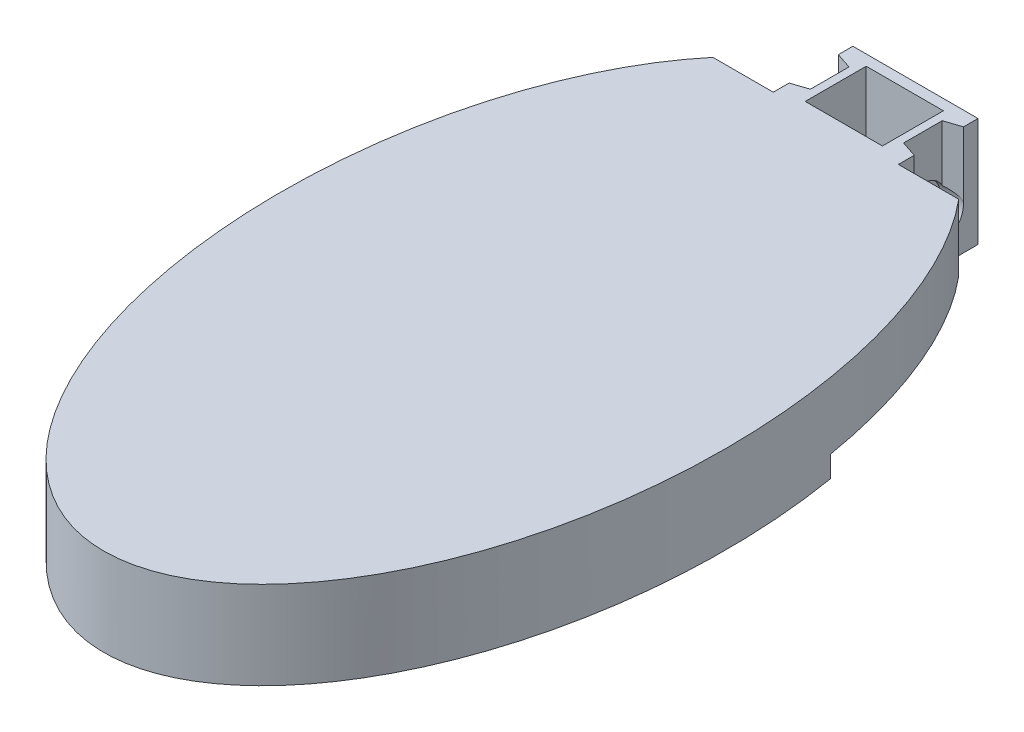
ISO-10303-21;
HEADER;
FILE_DESCRIPTION(('STEP AP214'),'2;1');
FILE_NAME('part.step','',(''),(''),'','','');
FILE_SCHEMA(('AUTOMOTIVE_DESIGN { 1 0 10303 214 1 1 1 1 }'));
ENDSEC;
DATA;
#1=APPLICATION_CONTEXT('core data for automotive mechanical design processes');
#2=APPLICATION_PROTOCOL_DEFINITION('international standard','automotive_design',2000,#1);
#3=PRODUCT_CONTEXT('',#1,'mechanical');
#4=PRODUCT('Part','Part','',(#3));
#5=PRODUCT_RELATED_PRODUCT_CATEGORY('part','',(#4));
#6=PRODUCT_DEFINITION_FORMATION('','',#4);
#7=PRODUCT_DEFINITION_CONTEXT('part definition',#1,'design');
#8=PRODUCT_DEFINITION('design','',#6,#7);
#9=PRODUCT_DEFINITION_SHAPE('','',#8);
#10=(LENGTH_UNIT() NAMED_UNIT(*) SI_UNIT(.MILLI.,.METRE.));
#11=(NAMED_UNIT(*) PLANE_ANGLE_UNIT() SI_UNIT($,.RADIAN.));
#12=(NAMED_UNIT(*) SI_UNIT($,.STERADIAN.) SOLID_ANGLE_UNIT());
#13=UNCERTAINTY_MEASURE_WITH_UNIT(LENGTH_MEASURE(1.E-05),#10,'distance_accuracy_value','');
#14=(GEOMETRIC_REPRESENTATION_CONTEXT(3) GLOBAL_UNCERTAINTY_ASSIGNED_CONTEXT((#13)) GLOBAL_UNIT_ASSIGNED_CONTEXT((#10,
#11,#12)) REPRESENTATION_CONTEXT('',''));
#15=CARTESIAN_POINT('',(0.,0.,0.));
#16=DIRECTION('',(0.,0.,1.));
#17=DIRECTION('',(1.,0.,0.));
#18=AXIS2_PLACEMENT_3D('',#15,#16,#17);
#19=CARTESIAN_POINT('',(-20.318866475745,-2.032,-10.922));
#20=DIRECTION('',(0.,0.,1.));
#21=DIRECTION('',(1.,0.,0.));
#22=AXIS2_PLACEMENT_3D('',#19,#20,#21);
#23=PLANE('',#22);
#24=DIRECTION('',(1.,0.,0.));
#25=VECTOR('',#24,1.);
#26=CARTESIAN_POINT('',(-20.318866475745,0.,-10.922));
#27=LINE('',#26,#25);
#28=CARTESIAN_POINT('',(-20.318866475745,0.,-10.922));
#29=VERTEX_POINT('',#28);
#30=CARTESIAN_POINT('',(-16.000866475745,0.,-10.922));
#31=VERTEX_POINT('',#30);
#32=EDGE_CURVE('E57',#29,#31,#27,.T.);
#33=ORIENTED_EDGE('',*,*,#32,.T.);
#34=DIRECTION('',(0.,-1.,0.));
#35=VECTOR('',#34,1.);
#36=CARTESIAN_POINT('',(-16.000866475745,36.0095961085165,-10.922));
#37=LINE('',#36,#35);
#38=CARTESIAN_POINT('',(-16.000866475745,-2.032,-10.922));
#39=VERTEX_POINT('',#38);
#40=EDGE_CURVE('E253',#31,#39,#37,.T.);
#41=ORIENTED_EDGE('',*,*,#40,.T.);
#42=DIRECTION('',(1.,0.,0.));
#43=VECTOR('',#42,1.);
#44=CARTESIAN_POINT('',(-20.318866475745,-2.032,-10.922));
#45=LINE('',#44,#43);
#46=CARTESIAN_POINT('',(-20.318866475745,-2.032,-10.922));
#47=VERTEX_POINT('',#46);
#48=EDGE_CURVE('E285',#47,#39,#45,.T.);
#49=ORIENTED_EDGE('',*,*,#48,.F.);
#50=DIRECTION('',(0.,1.,0.));
#51=VECTOR('',#50,1.);
#52=CARTESIAN_POINT('',(-20.318866475745,-2.032,-10.922));
#53=LINE('',#52,#51);
#54=EDGE_CURVE('E292',#47,#29,#53,.T.);
#55=ORIENTED_EDGE('',*,*,#54,.T.);
#56=EDGE_LOOP('',(#33,#41,#49,#55));
#57=FACE_BOUND('',#56,.T.);
#58=ADVANCED_FACE('F33',(#57),#23,.F.);
#59=CARTESIAN_POINT('',(0.,0.,0.));
#60=DIRECTION('',(0.,1.,0.));
#61=DIRECTION('',(0.,0.,1.));
#62=AXIS2_PLACEMENT_3D('',#59,#60,#61);
#63=PLANE('',#62);
#64=DIRECTION('',(1.,0.,0.));
#65=VECTOR('',#64,1.);
#66=CARTESIAN_POINT('',(-10.4004959003833,0.,-27.432));
#67=LINE('',#66,#65);
#68=CARTESIAN_POINT('',(-10.4004959003833,0.,-27.432));
#69=VERTEX_POINT('',#68);
#70=CARTESIAN_POINT('',(-6.858,0.,-27.432));
#71=VERTEX_POINT('',#70);
#72=EDGE_CURVE('E243',#69,#71,#67,.T.);
#73=ORIENTED_EDGE('',*,*,#72,.F.);
#74=DIRECTION('',(0.321232737556786,0.,-0.947000278944929));
#75=VECTOR('',#74,1.);
#76=CARTESIAN_POINT('',(-16.000866475745,0.,-10.922));
#77=LINE('',#76,#75);
#78=EDGE_CURVE('E249',#31,#69,#77,.T.);
#79=ORIENTED_EDGE('',*,*,#78,.F.);
#80=ORIENTED_EDGE('',*,*,#32,.F.);
#81=CARTESIAN_POINT('',(0.,0.,0.));
#82=DIRECTION('',(0.,1.,0.));
#83=DIRECTION('',(0.,0.,-1.));
#84=AXIS2_PLACEMENT_3D('',#81,#82,#83);
#85=ELLIPSE('',#84,38.1,21.209);
#86=CARTESIAN_POINT('',(-11.7237158631079,0.,-31.75));
#87=VERTEX_POINT('',#86);
#88=EDGE_CURVE('E446',#87,#29,#85,.T.);
#89=ORIENTED_EDGE('',*,*,#88,.F.);
#90=DIRECTION('',(1.,0.,0.));
#91=VECTOR('',#90,1.);
#92=CARTESIAN_POINT('',(-5.969,0.,-31.75));
#93=LINE('',#92,#91);
#94=CARTESIAN_POINT('',(-5.969,0.,-31.75));
#95=VERTEX_POINT('',#94);
#96=EDGE_CURVE('E295',#87,#95,#93,.T.);
#97=ORIENTED_EDGE('',*,*,#96,.T.);
#98=DIRECTION('',(1.,0.,0.));
#99=VECTOR('',#98,1.);
#100=CARTESIAN_POINT('',(-11.7237158631079,0.,-31.75));
#101=LINE('',#100,#99);
#102=CARTESIAN_POINT('',(5.969,0.,-31.75));
#103=VERTEX_POINT('',#102);
#104=EDGE_CURVE('E430',#95,#103,#101,.T.);
#105=ORIENTED_EDGE('',*,*,#104,.T.);
#106=DIRECTION('',(1.,0.,0.));
#107=VECTOR('',#106,1.);
#108=CARTESIAN_POINT('',(11.723715863108,0.,-31.75));
#109=LINE('',#108,#107);
#110=CARTESIAN_POINT('',(11.723715863108,0.,-31.75));
#111=VERTEX_POINT('',#110);
#112=EDGE_CURVE('E298',#103,#111,#109,.T.);
#113=ORIENTED_EDGE('',*,*,#112,.T.);
#114=CARTESIAN_POINT('',(20.318866475745,0.,-10.922));
#115=VERTEX_POINT('',#114);
#116=EDGE_CURVE('E440',#115,#111,#85,.T.);
#117=ORIENTED_EDGE('',*,*,#116,.F.);
#118=CARTESIAN_POINT('',(16.000866475745,0.,-10.922));
#119=VERTEX_POINT('',#118);
#120=EDGE_CURVE('E280',#119,#115,#27,.T.);
#121=ORIENTED_EDGE('',*,*,#120,.F.);
#122=DIRECTION('',(0.321232737556786,0.,0.947000278944929));
#123=VECTOR('',#122,1.);
#124=CARTESIAN_POINT('',(16.000866475745,0.,-10.922));
#125=LINE('',#124,#123);
#126=CARTESIAN_POINT('',(10.4004959003833,0.,-27.432));
#127=VERTEX_POINT('',#126);
#128=EDGE_CURVE('E267',#127,#119,#125,.T.);
#129=ORIENTED_EDGE('',*,*,#128,.F.);
#130=DIRECTION('',(1.,0.,0.));
#131=VECTOR('',#130,1.);
#132=CARTESIAN_POINT('',(10.4004959003833,0.,-27.432));
#133=LINE('',#132,#131);
#134=CARTESIAN_POINT('',(6.858,0.,-27.432));
#135=VERTEX_POINT('',#134);
#136=EDGE_CURVE('E270',#135,#127,#133,.T.);
#137=ORIENTED_EDGE('',*,*,#136,.F.);
#138=DIRECTION('',(0.,0.,-1.));
#139=VECTOR('',#138,1.);
#140=CARTESIAN_POINT('',(6.858,0.,-27.432));
#141=LINE('',#140,#139);
#142=CARTESIAN_POINT('',(6.858,0.,-21.082));
#143=VERTEX_POINT('',#142);
#144=EDGE_CURVE('E273',#143,#135,#141,.T.);
#145=ORIENTED_EDGE('',*,*,#144,.F.);
#146=CARTESIAN_POINT('',(0.,0.,-21.082));
#147=DIRECTION('',(0.,1.,0.));
#148=DIRECTION('',(0.,0.,1.));
#149=AXIS2_PLACEMENT_3D('',#146,#147,#148);
#150=CIRCLE('',#149,6.858);
#151=CARTESIAN_POINT('',(-6.858,0.,-21.082));
#152=VERTEX_POINT('',#151);
#153=EDGE_CURVE('E276',#152,#143,#150,.T.);
#154=ORIENTED_EDGE('',*,*,#153,.F.);
#155=DIRECTION('',(0.,0.,1.));
#156=VECTOR('',#155,1.);
#157=CARTESIAN_POINT('',(-6.858,0.,-27.432));
#158=LINE('',#157,#156);
#159=EDGE_CURVE('E258',#71,#152,#158,.T.);
#160=ORIENTED_EDGE('',*,*,#159,.F.);
#161=EDGE_LOOP('',(#73,#79,#80,#89,#97,#105,#113,#117,#121,#129,#137,#145,#154,#160));
#162=FACE_BOUND('',#161,.T.);
#163=ADVANCED_FACE('F255',(#162),#63,.F.);
#164=CARTESIAN_POINT('',(-5.969,3.81,-24.1554));
#165=DIRECTION('',(-1.,0.,0.));
#166=DIRECTION('',(0.,0.,1.));
#167=AXIS2_PLACEMENT_3D('',#164,#165,#166);
#168=PLANE('',#167);
#169=DIRECTION('',(0.,-1.,0.));
#170=VECTOR('',#169,1.);
#171=CARTESIAN_POINT('',(-5.969,6.35,-31.75));
#172=LINE('',#171,#170);
#173=CARTESIAN_POINT('',(-5.969,-2.032,-31.75));
#174=VERTEX_POINT('',#173);
#175=EDGE_CURVE('E384',#95,#174,#172,.T.);
#176=ORIENTED_EDGE('',*,*,#175,.F.);
#177=CARTESIAN_POINT('',(-5.969,6.35,-31.75));
#178=VERTEX_POINT('',#177);
#179=EDGE_CURVE('E386',#178,#95,#172,.T.);
#180=ORIENTED_EDGE('',*,*,#179,.F.);
#181=DIRECTION('',(0.,0.,1.));
#182=VECTOR('',#181,1.);
#183=CARTESIAN_POINT('',(-5.969,6.35,-39.3446));
#184=LINE('',#183,#182);
#185=CARTESIAN_POINT('',(-5.969,6.35,-33.2612999999999));
#186=VERTEX_POINT('',#185);
#187=EDGE_CURVE('E385',#186,#178,#184,.T.);
#188=ORIENTED_EDGE('',*,*,#187,.F.);
#189=DIRECTION('',(0.,1.,0.));
#190=VECTOR('',#189,1.);
#191=CARTESIAN_POINT('',(-5.969,0.,-33.2612999999999));
#192=LINE('',#191,#190);
#193=CARTESIAN_POINT('',(-5.969,0.,-33.2612999999999));
#194=VERTEX_POINT('',#193);
#195=EDGE_CURVE('E341',#194,#186,#192,.T.);
#196=ORIENTED_EDGE('',*,*,#195,.F.);
#197=CARTESIAN_POINT('',(-5.969,0.,-35.6108));
#198=DIRECTION('',(-1.,0.,0.));
#199=DIRECTION('',(0.,0.,1.));
#200=AXIS2_PLACEMENT_3D('',#197,#198,#199);
#201=CIRCLE('',#200,2.3495);
#202=CARTESIAN_POINT('',(-5.969,0.,-37.9603));
#203=VERTEX_POINT('',#202);
#204=EDGE_CURVE('E345',#203,#194,#201,.T.);
#205=ORIENTED_EDGE('',*,*,#204,.F.);
#206=DIRECTION('',(0.,1.,0.));
#207=VECTOR('',#206,1.);
#208=CARTESIAN_POINT('',(-5.969,0.,-37.9603));
#209=LINE('',#208,#207);
#210=CARTESIAN_POINT('',(-5.969,6.35,-37.9603));
#211=VERTEX_POINT('',#210);
#212=EDGE_CURVE('E342',#203,#211,#209,.T.);
#213=ORIENTED_EDGE('',*,*,#212,.T.);
#214=CARTESIAN_POINT('',(-5.969,6.35,-39.3446));
#215=VERTEX_POINT('',#214);
#216=EDGE_CURVE('E381',#215,#211,#184,.T.);
#217=ORIENTED_EDGE('',*,*,#216,.F.);
#218=DIRECTION('',(0.,1.,0.));
#219=VECTOR('',#218,1.);
#220=CARTESIAN_POINT('',(-5.969,-4.064,-39.3446));
#221=LINE('',#220,#219);
#222=CARTESIAN_POINT('',(-5.969,-4.064,-39.3446));
#223=VERTEX_POINT('',#222);
#224=EDGE_CURVE('E397',#223,#215,#221,.T.);
#225=ORIENTED_EDGE('',*,*,#224,.F.);
#226=DIRECTION('',(0.,0.,-1.));
#227=VECTOR('',#226,1.);
#228=CARTESIAN_POINT('',(-5.969,-4.064,-34.8996));
#229=LINE('',#228,#227);
#230=CARTESIAN_POINT('',(-5.969,-4.064,-34.8996));
#231=VERTEX_POINT('',#230);
#232=EDGE_CURVE('E394',#231,#223,#229,.T.);
#233=ORIENTED_EDGE('',*,*,#232,.F.);
#234=DIRECTION('',(0.,-0.554700196225229,-0.832050294337844));
#235=VECTOR('',#234,1.);
#236=CARTESIAN_POINT('',(-5.969,-2.032,-31.8516));
#237=LINE('',#236,#235);
#238=CARTESIAN_POINT('',(-5.969,-2.032,-31.8516));
#239=VERTEX_POINT('',#238);
#240=EDGE_CURVE('E391',#239,#231,#237,.T.);
#241=ORIENTED_EDGE('',*,*,#240,.F.);
#242=DIRECTION('',(0.,0.,-1.));
#243=VECTOR('',#242,1.);
#244=CARTESIAN_POINT('',(-5.969,-2.032,-31.75));
#245=LINE('',#244,#243);
#246=EDGE_CURVE('E388',#174,#239,#245,.T.);
#247=ORIENTED_EDGE('',*,*,#246,.F.);
#248=EDGE_LOOP('',(#176,#180,#188,#196,#205,#213,#217,#225,#233,#241,#247));
#249=FACE_BOUND('',#248,.T.);
#250=ADVANCED_FACE('F475',(#249),#168,.T.);
#251=CARTESIAN_POINT('',(5.969,3.81,-31.75));
#252=DIRECTION('',(1.,0.,0.));
#253=DIRECTION('',(0.,0.,-1.));
#254=AXIS2_PLACEMENT_3D('',#251,#252,#253);
#255=PLANE('',#254);
#256=DIRECTION('',(0.,-1.,0.));
#257=VECTOR('',#256,1.);
#258=CARTESIAN_POINT('',(5.969,6.35,-31.75));
#259=LINE('',#258,#257);
#260=CARTESIAN_POINT('',(5.969,6.35,-31.75));
#261=VERTEX_POINT('',#260);
#262=EDGE_CURVE('E405',#261,#103,#259,.T.);
#263=ORIENTED_EDGE('',*,*,#262,.T.);
#264=CARTESIAN_POINT('',(5.969,-2.032,-31.75));
#265=VERTEX_POINT('',#264);
#266=EDGE_CURVE('E404',#103,#265,#259,.T.);
#267=ORIENTED_EDGE('',*,*,#266,.T.);
#268=DIRECTION('',(0.,0.,-1.));
#269=VECTOR('',#268,1.);
#270=CARTESIAN_POINT('',(5.969,-2.032,-31.75));
#271=LINE('',#270,#269);
#272=CARTESIAN_POINT('',(5.969,-2.032,-31.8516));
#273=VERTEX_POINT('',#272);
#274=EDGE_CURVE('E407',#265,#273,#271,.T.);
#275=ORIENTED_EDGE('',*,*,#274,.T.);
#276=DIRECTION('',(0.,-0.554700196225229,-0.832050294337844));
#277=VECTOR('',#276,1.);
#278=CARTESIAN_POINT('',(5.969,-2.032,-31.8516));
#279=LINE('',#278,#277);
#280=CARTESIAN_POINT('',(5.969,-4.064,-34.8996));
#281=VERTEX_POINT('',#280);
#282=EDGE_CURVE('E410',#273,#281,#279,.T.);
#283=ORIENTED_EDGE('',*,*,#282,.T.);
#284=DIRECTION('',(0.,0.,-1.));
#285=VECTOR('',#284,1.);
#286=CARTESIAN_POINT('',(5.969,-4.064,-34.8996));
#287=LINE('',#286,#285);
#288=CARTESIAN_POINT('',(5.969,-4.064,-39.3446));
#289=VERTEX_POINT('',#288);
#290=EDGE_CURVE('E413',#281,#289,#287,.T.);
#291=ORIENTED_EDGE('',*,*,#290,.T.);
#292=DIRECTION('',(0.,1.,0.));
#293=VECTOR('',#292,1.);
#294=CARTESIAN_POINT('',(5.969,-4.064,-39.3446));
#295=LINE('',#294,#293);
#296=CARTESIAN_POINT('',(5.969,6.35,-39.3446));
#297=VERTEX_POINT('',#296);
#298=EDGE_CURVE('E416',#289,#297,#295,.T.);
#299=ORIENTED_EDGE('',*,*,#298,.T.);
#300=DIRECTION('',(0.,0.,1.));
#301=VECTOR('',#300,1.);
#302=CARTESIAN_POINT('',(5.969,6.35,-39.3446));
#303=LINE('',#302,#301);
#304=CARTESIAN_POINT('',(5.969,6.35,-37.9603));
#305=VERTEX_POINT('',#304);
#306=EDGE_CURVE('E401',#297,#305,#303,.T.);
#307=ORIENTED_EDGE('',*,*,#306,.T.);
#308=DIRECTION('',(0.,1.,0.));
#309=VECTOR('',#308,1.);
#310=CARTESIAN_POINT('',(5.969,0.,-37.9603));
#311=LINE('',#310,#309);
#312=CARTESIAN_POINT('',(5.969,0.,-37.9603));
#313=VERTEX_POINT('',#312);
#314=EDGE_CURVE('E365',#313,#305,#311,.T.);
#315=ORIENTED_EDGE('',*,*,#314,.F.);
#316=CARTESIAN_POINT('',(5.969,0.,-35.6108));
#317=DIRECTION('',(-1.,0.,0.));
#318=DIRECTION('',(0.,0.,1.));
#319=AXIS2_PLACEMENT_3D('',#316,#317,#318);
#320=CIRCLE('',#319,2.3495);
#321=CARTESIAN_POINT('',(5.969,0.,-33.2612999999999));
#322=VERTEX_POINT('',#321);
#323=EDGE_CURVE('E369',#313,#322,#320,.T.);
#324=ORIENTED_EDGE('',*,*,#323,.T.);
#325=DIRECTION('',(0.,1.,0.));
#326=VECTOR('',#325,1.);
#327=CARTESIAN_POINT('',(5.969,0.,-33.2612999999999));
#328=LINE('',#327,#326);
#329=CARTESIAN_POINT('',(5.969,6.35,-33.2612999999999));
#330=VERTEX_POINT('',#329);
#331=EDGE_CURVE('E366',#322,#330,#328,.T.);
#332=ORIENTED_EDGE('',*,*,#331,.T.);
#333=EDGE_CURVE('E380',#330,#261,#303,.T.);
#334=ORIENTED_EDGE('',*,*,#333,.T.);
#335=EDGE_LOOP('',(#263,#267,#275,#283,#291,#299,#307,#315,#324,#332,#334));
#336=FACE_BOUND('',#335,.T.);
#337=ADVANCED_FACE('F497',(#336),#255,.T.);
#338=CARTESIAN_POINT('',(0.,6.35,0.));
#339=DIRECTION('',(0.,1.,0.));
#340=DIRECTION('',(0.,0.,1.));
#341=AXIS2_PLACEMENT_3D('',#338,#339,#340);
#342=PLANE('',#341);
#343=DIRECTION('',(1.,0.,0.));
#344=VECTOR('',#343,1.);
#345=CARTESIAN_POINT('',(-3.683,6.35,-32.512));
#346=LINE('',#345,#344);
#347=CARTESIAN_POINT('',(-3.683,6.35,-32.512));
#348=VERTEX_POINT('',#347);
#349=CARTESIAN_POINT('',(3.683,6.35,-32.512));
#350=VERTEX_POINT('',#349);
#351=EDGE_CURVE('E308',#348,#350,#346,.T.);
#352=ORIENTED_EDGE('',*,*,#351,.F.);
#353=DIRECTION('',(0.,0.,1.));
#354=VECTOR('',#353,1.);
#355=CARTESIAN_POINT('',(-3.683,6.35,-38.3286));
#356=LINE('',#355,#354);
#357=CARTESIAN_POINT('',(-3.683,6.35,-38.3286));
#358=VERTEX_POINT('',#357);
#359=EDGE_CURVE('E301',#358,#348,#356,.T.);
#360=ORIENTED_EDGE('',*,*,#359,.F.);
#361=DIRECTION('',(-1.,0.,0.));
#362=VECTOR('',#361,1.);
#363=CARTESIAN_POINT('',(-3.683,6.35,-38.3286));
#364=LINE('',#363,#362);
#365=CARTESIAN_POINT('',(3.683,6.35,-38.3286));
#366=VERTEX_POINT('',#365);
#367=EDGE_CURVE('E302',#366,#358,#364,.T.);
#368=ORIENTED_EDGE('',*,*,#367,.F.);
#369=DIRECTION('',(0.,0.,-1.));
#370=VECTOR('',#369,1.);
#371=CARTESIAN_POINT('',(3.683,6.35,-38.3286));
#372=LINE('',#371,#370);
#373=EDGE_CURVE('E305',#350,#366,#372,.T.);
#374=ORIENTED_EDGE('',*,*,#373,.F.);
#375=EDGE_LOOP('',(#352,#360,#368,#374));
#376=FACE_BOUND('',#375,.T.);
#377=DIRECTION('',(-0.948683298050512,0.,-0.316227766016843));
#378=VECTOR('',#377,1.);
#379=CARTESIAN_POINT('',(-4.445,6.35,-37.4523));
#380=LINE('',#379,#378);
#381=CARTESIAN_POINT('',(-4.445,6.35,-37.4523));
#382=VERTEX_POINT('',#381);
#383=EDGE_CURVE('E339',#382,#211,#380,.T.);
#384=ORIENTED_EDGE('',*,*,#383,.F.);
#385=DIRECTION('',(0.,0.,-1.));
#386=VECTOR('',#385,1.);
#387=CARTESIAN_POINT('',(-4.445,6.35,-33.7693));
#388=LINE('',#387,#386);
#389=CARTESIAN_POINT('',(-4.445,6.35,-33.7693));
#390=VERTEX_POINT('',#389);
#391=EDGE_CURVE('E336',#390,#382,#388,.T.);
#392=ORIENTED_EDGE('',*,*,#391,.F.);
#393=DIRECTION('',(0.948683298050512,0.,-0.316227766016843));
#394=VECTOR('',#393,1.);
#395=CARTESIAN_POINT('',(-5.969,6.35,-33.2612999999999));
#396=LINE('',#395,#394);
#397=EDGE_CURVE('E333',#186,#390,#396,.T.);
#398=ORIENTED_EDGE('',*,*,#397,.F.);
#399=ORIENTED_EDGE('',*,*,#187,.T.);
#400=DIRECTION('',(1.,0.,0.));
#401=VECTOR('',#400,1.);
#402=CARTESIAN_POINT('',(-11.7237158631079,6.35,-31.75));
#403=LINE('',#402,#401);
#404=CARTESIAN_POINT('',(-11.7237158631079,6.35,-31.75));
#405=VERTEX_POINT('',#404);
#406=EDGE_CURVE('E434',#405,#178,#403,.T.);
#407=ORIENTED_EDGE('',*,*,#406,.F.);
#408=CARTESIAN_POINT('',(0.,6.35,0.));
#409=DIRECTION('',(0.,1.,0.));
#410=DIRECTION('',(0.,0.,-1.));
#411=AXIS2_PLACEMENT_3D('',#408,#409,#410);
#412=ELLIPSE('',#411,38.1,21.209);
#413=CARTESIAN_POINT('',(11.723715863108,6.35,-31.75));
#414=VERTEX_POINT('',#413);
#415=EDGE_CURVE('E441',#405,#414,#412,.T.);
#416=ORIENTED_EDGE('',*,*,#415,.T.);
#417=EDGE_CURVE('E421',#261,#414,#403,.T.);
#418=ORIENTED_EDGE('',*,*,#417,.F.);
#419=ORIENTED_EDGE('',*,*,#333,.F.);
#420=DIRECTION('',(-0.948683298050512,0.,-0.316227766016843));
#421=VECTOR('',#420,1.);
#422=CARTESIAN_POINT('',(5.969,6.35,-33.2612999999999));
#423=LINE('',#422,#421);
#424=CARTESIAN_POINT('',(4.445,6.35,-33.7693));
#425=VERTEX_POINT('',#424);
#426=EDGE_CURVE('E362',#330,#425,#423,.T.);
#427=ORIENTED_EDGE('',*,*,#426,.T.);
#428=DIRECTION('',(0.,0.,-1.));
#429=VECTOR('',#428,1.);
#430=CARTESIAN_POINT('',(4.445,6.35,-33.7693));
#431=LINE('',#430,#429);
#432=CARTESIAN_POINT('',(4.445,6.35,-37.4523));
#433=VERTEX_POINT('',#432);
#434=EDGE_CURVE('E359',#425,#433,#431,.T.);
#435=ORIENTED_EDGE('',*,*,#434,.T.);
#436=DIRECTION('',(0.948683298050512,0.,-0.316227766016843));
#437=VECTOR('',#436,1.);
#438=CARTESIAN_POINT('',(4.445,6.35,-37.4523));
#439=LINE('',#438,#437);
#440=EDGE_CURVE('E356',#433,#305,#439,.T.);
#441=ORIENTED_EDGE('',*,*,#440,.T.);
#442=ORIENTED_EDGE('',*,*,#306,.F.);
#443=DIRECTION('',(1.,0.,0.));
#444=VECTOR('',#443,1.);
#445=CARTESIAN_POINT('',(-5.969,6.35,-39.3446));
#446=LINE('',#445,#444);
#447=EDGE_CURVE('E419',#215,#297,#446,.T.);
#448=ORIENTED_EDGE('',*,*,#447,.F.);
#449=ORIENTED_EDGE('',*,*,#216,.T.);
#450=EDGE_LOOP('',(#384,#392,#398,#399,#407,#416,#418,#419,#427,#435,#441,#442,#448,#449));
#451=FACE_BOUND('',#450,.T.);
#452=ADVANCED_FACE('F480',(#376,#451),#342,.T.);
#453=CARTESIAN_POINT('',(5.969,0.,-35.6108));
#454=DIRECTION('',(1.,0.,0.));
#455=DIRECTION('',(0.,0.,-1.));
#456=AXIS2_PLACEMENT_3D('',#453,#454,#455);
#457=CONICAL_SURFACE('',#456,2.3495,0.16514867741463);
#458=CARTESIAN_POINT('',(4.064,0.,-35.6108));
#459=DIRECTION('',(-1.,0.,0.));
#460=DIRECTION('',(0.,0.,1.));
#461=AXIS2_PLACEMENT_3D('',#458,#459,#460);
#462=CIRCLE('',#461,2.032);
#463=CARTESIAN_POINT('',(4.064,0.,-33.5788));
#464=VERTEX_POINT('',#463);
#465=EDGE_CURVE('E377',#464,#464,#462,.T.);
#466=ORIENTED_EDGE('',*,*,#465,.T.);
#467=EDGE_LOOP('',(#466));
#468=FACE_BOUND('',#467,.T.);
#469=CARTESIAN_POINT('',(4.445,0.,-35.6108));
#470=DIRECTION('',(1.,0.,0.));
#471=DIRECTION('',(0.,0.,-1.));
#472=AXIS2_PLACEMENT_3D('',#469,#470,#471);
#473=CIRCLE('',#472,2.0955);
#474=CARTESIAN_POINT('',(4.445,0.999998999999509,-37.4523));
#475=VERTEX_POINT('',#474);
#476=CARTESIAN_POINT('',(4.445,0.999998999999507,-33.7693));
#477=VERTEX_POINT('',#476);
#478=EDGE_CURVE('E450',#475,#477,#473,.T.);
#479=ORIENTED_EDGE('',*,*,#478,.T.);
#480=CARTESIAN_POINT('',(1.27000000000007,0.,-34.8276333333333));
#481=DIRECTION('',(0.316227766016843,0.,-0.948683298050512));
#482=DIRECTION('',(0.948683298050512,0.,0.316227766016843));
#483=AXIS2_PLACEMENT_3D('',#480,#481,#482);
#484=ELLIPSE('',#483,4.953180908377,1.35648445746103);
#485=EDGE_CURVE('E453',#477,#322,#484,.T.);
#486=ORIENTED_EDGE('',*,*,#485,.T.);
#487=ORIENTED_EDGE('',*,*,#323,.F.);
#488=CARTESIAN_POINT('',(1.27000000000007,0.,-36.3939666666666));
#489=DIRECTION('',(0.316227766016843,0.,0.948683298050512));
#490=DIRECTION('',(0.948683298050512,0.,-0.316227766016843));
#491=AXIS2_PLACEMENT_3D('',#488,#489,#490);
#492=ELLIPSE('',#491,4.95318090837701,1.35648445746103);
#493=EDGE_CURVE('E445',#313,#475,#492,.T.);
#494=ORIENTED_EDGE('',*,*,#493,.T.);
#495=EDGE_LOOP('',(#479,#486,#487,#494));
#496=FACE_BOUND('',#495,.T.);
#497=ADVANCED_FACE('F511',(#468,#496),#457,.F.);
#498=CARTESIAN_POINT('',(-11.7237158631079,0.,-31.75));
#499=DIRECTION('',(0.,0.,1.));
#500=DIRECTION('',(1.,0.,0.));
#501=AXIS2_PLACEMENT_3D('',#498,#499,#500);
#502=PLANE('',#501);
#503=ORIENTED_EDGE('',*,*,#179,.T.);
#504=ORIENTED_EDGE('',*,*,#96,.F.);
#505=DIRECTION('',(0.,1.,0.));
#506=VECTOR('',#505,1.);
#507=CARTESIAN_POINT('',(-11.7237158631079,0.,-31.75));
#508=LINE('',#507,#506);
#509=EDGE_CURVE('E433',#87,#405,#508,.T.);
#510=ORIENTED_EDGE('',*,*,#509,.T.);
#511=ORIENTED_EDGE('',*,*,#406,.T.);
#512=EDGE_LOOP('',(#503,#504,#510,#511));
#513=FACE_BOUND('',#512,.T.);
#514=ADVANCED_FACE('F484',(#513),#502,.F.);
#515=DIRECTION('',(0.,-1.,0.));
#516=VECTOR('',#515,1.);
#517=SURFACE_OF_LINEAR_EXTRUSION('',#412,#516);
#518=ORIENTED_EDGE('',*,*,#88,.T.);
#519=ORIENTED_EDGE('',*,*,#54,.F.);
#520=CARTESIAN_POINT('',(0.,-2.032,0.));
#521=DIRECTION('',(0.,-1.,0.));
#522=DIRECTION('',(0.,0.,-1.));
#523=AXIS2_PLACEMENT_3D('',#520,#521,#522);
#524=ELLIPSE('',#523,38.1,21.209);
#525=CARTESIAN_POINT('',(20.318866475745,-2.032,-10.922));
#526=VERTEX_POINT('',#525);
#527=EDGE_CURVE('E281',#526,#47,#524,.T.);
#528=ORIENTED_EDGE('',*,*,#527,.F.);
#529=DIRECTION('',(0.,1.,0.));
#530=VECTOR('',#529,1.);
#531=CARTESIAN_POINT('',(20.318866475745,-2.032,-10.922));
#532=LINE('',#531,#530);
#533=EDGE_CURVE('E288',#526,#115,#532,.T.);
#534=ORIENTED_EDGE('',*,*,#533,.T.);
#535=ORIENTED_EDGE('',*,*,#116,.T.);
#536=DIRECTION('',(0.,1.,0.));
#537=VECTOR('',#536,1.);
#538=CARTESIAN_POINT('',(11.723715863108,0.,-31.75));
#539=LINE('',#538,#537);
#540=EDGE_CURVE('E437',#111,#414,#539,.T.);
#541=ORIENTED_EDGE('',*,*,#540,.T.);
#542=ORIENTED_EDGE('',*,*,#415,.F.);
#543=ORIENTED_EDGE('',*,*,#509,.F.);
#544=EDGE_LOOP('',(#518,#519,#528,#534,#535,#541,#542,#543));
#545=FACE_BOUND('',#544,.T.);
#546=ADVANCED_FACE('F35',(#545),#517,.F.);
#547=ORIENTED_EDGE('',*,*,#540,.F.);
#548=ORIENTED_EDGE('',*,*,#112,.F.);
#549=ORIENTED_EDGE('',*,*,#262,.F.);
#550=ORIENTED_EDGE('',*,*,#417,.T.);
#551=EDGE_LOOP('',(#547,#548,#549,#550));
#552=FACE_BOUND('',#551,.T.);
#553=ADVANCED_FACE('F503',(#552),#502,.F.);
#554=CARTESIAN_POINT('',(-5.969,6.35,-31.75));
#555=DIRECTION('',(0.,0.,1.));
#556=DIRECTION('',(1.,0.,0.));
#557=AXIS2_PLACEMENT_3D('',#554,#555,#556);
#558=PLANE('',#557);
#559=ORIENTED_EDGE('',*,*,#104,.F.);
#560=ORIENTED_EDGE('',*,*,#175,.T.);
#561=DIRECTION('',(1.,0.,0.));
#562=VECTOR('',#561,1.);
#563=CARTESIAN_POINT('',(-5.969,-2.032,-31.75));
#564=LINE('',#563,#562);
#565=EDGE_CURVE('E400',#174,#265,#564,.T.);
#566=ORIENTED_EDGE('',*,*,#565,.T.);
#567=ORIENTED_EDGE('',*,*,#266,.F.);
#568=EDGE_LOOP('',(#559,#560,#566,#567));
#569=FACE_BOUND('',#568,.T.);
#570=ADVANCED_FACE('F493',(#569),#558,.T.);
#571=CARTESIAN_POINT('',(-5.969,-4.064,-39.3446));
#572=DIRECTION('',(0.,0.,-1.));
#573=DIRECTION('',(0.,1.,0.));
#574=AXIS2_PLACEMENT_3D('',#571,#572,#573);
#575=PLANE('',#574);
#576=ORIENTED_EDGE('',*,*,#298,.F.);
#577=DIRECTION('',(1.,0.,0.));
#578=VECTOR('',#577,1.);
#579=CARTESIAN_POINT('',(-5.969,-4.064,-39.3446));
#580=LINE('',#579,#578);
#581=EDGE_CURVE('E422',#223,#289,#580,.T.);
#582=ORIENTED_EDGE('',*,*,#581,.F.);
#583=ORIENTED_EDGE('',*,*,#224,.T.);
#584=ORIENTED_EDGE('',*,*,#447,.T.);
#585=EDGE_LOOP('',(#576,#582,#583,#584));
#586=FACE_BOUND('',#585,.T.);
#587=ADVANCED_FACE('F522',(#586),#575,.T.);
#588=CARTESIAN_POINT('',(-5.969,-4.064,-34.8996));
#589=DIRECTION('',(0.,-1.,0.));
#590=DIRECTION('',(0.,0.,-1.));
#591=AXIS2_PLACEMENT_3D('',#588,#589,#590);
#592=PLANE('',#591);
#593=ORIENTED_EDGE('',*,*,#290,.F.);
#594=DIRECTION('',(1.,0.,0.));
#595=VECTOR('',#594,1.);
#596=CARTESIAN_POINT('',(-5.969,-4.064,-34.8996));
#597=LINE('',#596,#595);
#598=EDGE_CURVE('E424',#231,#281,#597,.T.);
#599=ORIENTED_EDGE('',*,*,#598,.F.);
#600=ORIENTED_EDGE('',*,*,#232,.T.);
#601=ORIENTED_EDGE('',*,*,#581,.T.);
#602=EDGE_LOOP('',(#593,#599,#600,#601));
#603=FACE_BOUND('',#602,.T.);
#604=ADVANCED_FACE('F818',(#603),#592,.T.);
#605=CARTESIAN_POINT('',(-5.969,-2.032,-31.8516));
#606=DIRECTION('',(0.,-0.832050294337844,0.554700196225229));
#607=DIRECTION('',(0.,-0.554700196225229,-0.832050294337844));
#608=AXIS2_PLACEMENT_3D('',#605,#606,#607);
#609=PLANE('',#608);
#610=ORIENTED_EDGE('',*,*,#282,.F.);
#611=DIRECTION('',(1.,0.,0.));
#612=VECTOR('',#611,1.);
#613=CARTESIAN_POINT('',(-5.969,-2.032,-31.8516));
#614=LINE('',#613,#612);
#615=EDGE_CURVE('E426',#239,#273,#614,.T.);
#616=ORIENTED_EDGE('',*,*,#615,.F.);
#617=ORIENTED_EDGE('',*,*,#240,.T.);
#618=ORIENTED_EDGE('',*,*,#598,.T.);
#619=EDGE_LOOP('',(#610,#616,#617,#618));
#620=FACE_BOUND('',#619,.T.);
#621=ADVANCED_FACE('F808',(#620),#609,.T.);
#622=CARTESIAN_POINT('',(-5.969,-2.032,-31.75));
#623=DIRECTION('',(0.,-1.,0.));
#624=DIRECTION('',(0.,0.,-1.));
#625=AXIS2_PLACEMENT_3D('',#622,#623,#624);
#626=PLANE('',#625);
#627=ORIENTED_EDGE('',*,*,#274,.F.);
#628=ORIENTED_EDGE('',*,*,#565,.F.);
#629=ORIENTED_EDGE('',*,*,#246,.T.);
#630=ORIENTED_EDGE('',*,*,#615,.T.);
#631=EDGE_LOOP('',(#627,#628,#629,#630));
#632=FACE_BOUND('',#631,.T.);
#633=ADVANCED_FACE('F798',(#632),#626,.T.);
#634=CARTESIAN_POINT('',(4.064,0.,-35.6108));
#635=DIRECTION('',(1.,0.,0.));
#636=DIRECTION('',(0.,0.,-1.));
#637=AXIS2_PLACEMENT_3D('',#634,#635,#636);
#638=PLANE('',#637);
#639=ORIENTED_EDGE('',*,*,#465,.F.);
#640=EDGE_LOOP('',(#639));
#641=FACE_BOUND('',#640,.T.);
#642=ADVANCED_FACE('F776',(#641),#638,.T.);
#643=CARTESIAN_POINT('',(5.969,0.,-33.2612999999999));
#644=DIRECTION('',(0.316227766016843,0.,-0.948683298050512));
#645=DIRECTION('',(-0.948683298050512,0.,-0.316227766016843));
#646=AXIS2_PLACEMENT_3D('',#643,#644,#645);
#647=PLANE('',#646);
#648=DIRECTION('',(0.,1.,0.));
#649=VECTOR('',#648,1.);
#650=CARTESIAN_POINT('',(4.445,0.,-33.7693));
#651=LINE('',#650,#649);
#652=EDGE_CURVE('E370',#477,#425,#651,.T.);
#653=ORIENTED_EDGE('',*,*,#652,.T.);
#654=ORIENTED_EDGE('',*,*,#426,.F.);
#655=ORIENTED_EDGE('',*,*,#331,.F.);
#656=ORIENTED_EDGE('',*,*,#485,.F.);
#657=EDGE_LOOP('',(#653,#654,#655,#656));
#658=FACE_BOUND('',#657,.T.);
#659=ADVANCED_FACE('F506',(#658),#647,.T.);
#660=CARTESIAN_POINT('',(4.445,0.,-33.7693));
#661=DIRECTION('',(1.,0.,0.));
#662=DIRECTION('',(0.,0.,-1.));
#663=AXIS2_PLACEMENT_3D('',#660,#661,#662);
#664=PLANE('',#663);
#665=DIRECTION('',(0.,1.,0.));
#666=VECTOR('',#665,1.);
#667=CARTESIAN_POINT('',(4.445,0.,-37.4523));
#668=LINE('',#667,#666);
#669=EDGE_CURVE('E372',#475,#433,#668,.T.);
#670=ORIENTED_EDGE('',*,*,#669,.T.);
#671=ORIENTED_EDGE('',*,*,#434,.F.);
#672=ORIENTED_EDGE('',*,*,#652,.F.);
#673=ORIENTED_EDGE('',*,*,#478,.F.);
#674=EDGE_LOOP('',(#670,#671,#672,#673));
#675=FACE_BOUND('',#674,.T.);
#676=ADVANCED_FACE('F514',(#675),#664,.T.);
#677=CARTESIAN_POINT('',(4.445,0.,-37.4523));
#678=DIRECTION('',(0.316227766016843,0.,0.948683298050512));
#679=DIRECTION('',(0.948683298050512,0.,-0.316227766016843));
#680=AXIS2_PLACEMENT_3D('',#677,#678,#679);
#681=PLANE('',#680);
#682=ORIENTED_EDGE('',*,*,#314,.T.);
#683=ORIENTED_EDGE('',*,*,#440,.F.);
#684=ORIENTED_EDGE('',*,*,#669,.F.);
#685=ORIENTED_EDGE('',*,*,#493,.F.);
#686=EDGE_LOOP('',(#682,#683,#684,#685));
#687=FACE_BOUND('',#686,.T.);
#688=ADVANCED_FACE('F517',(#687),#681,.T.);
#689=CARTESIAN_POINT('',(-4.064,0.,-35.6108));
#690=DIRECTION('',(-1.,0.,0.));
#691=DIRECTION('',(0.,0.,-1.));
#692=AXIS2_PLACEMENT_3D('',#689,#690,#691);
#693=PLANE('',#692);
#694=CARTESIAN_POINT('',(-4.064,0.,-35.6108));
#695=DIRECTION('',(-1.,0.,0.));
#696=DIRECTION('',(0.,0.,1.));
#697=AXIS2_PLACEMENT_3D('',#694,#695,#696);
#698=CIRCLE('',#697,2.032);
#699=CARTESIAN_POINT('',(-4.064,0.,-33.5788));
#700=VERTEX_POINT('',#699);
#701=EDGE_CURVE('E353',#700,#700,#698,.T.);
#702=ORIENTED_EDGE('',*,*,#701,.T.);
#703=EDGE_LOOP('',(#702));
#704=FACE_BOUND('',#703,.T.);
#705=ADVANCED_FACE('F535',(#704),#693,.T.);
#706=CARTESIAN_POINT('',(-5.969,0.,-35.6108));
#707=DIRECTION('',(-1.,0.,0.));
#708=DIRECTION('',(0.,0.,-1.));
#709=AXIS2_PLACEMENT_3D('',#706,#707,#708);
#710=CONICAL_SURFACE('',#709,2.3495,0.16514867741463);
#711=CARTESIAN_POINT('',(-1.27000000000007,0.,-36.3939666666666));
#712=DIRECTION('',(0.316227766016843,0.,-0.948683298050512));
#713=DIRECTION('',(-0.948683298050512,0.,-0.316227766016843));
#714=AXIS2_PLACEMENT_3D('',#711,#712,#713);
#715=ELLIPSE('',#714,4.95318090837701,1.35648445746103);
#716=CARTESIAN_POINT('',(-4.445,0.999998999999507,-37.4523));
#717=VERTEX_POINT('',#716);
#718=EDGE_CURVE('E11',#203,#717,#715,.T.);
#719=ORIENTED_EDGE('',*,*,#718,.F.);
#720=ORIENTED_EDGE('',*,*,#204,.T.);
#721=CARTESIAN_POINT('',(-1.27000000000007,0.,-34.8276333333333));
#722=DIRECTION('',(0.316227766016843,0.,0.948683298050512));
#723=DIRECTION('',(-0.948683298050512,0.,0.316227766016843));
#724=AXIS2_PLACEMENT_3D('',#721,#722,#723);
#725=ELLIPSE('',#724,4.953180908377,1.35648445746103);
#726=CARTESIAN_POINT('',(-4.445,0.999998999999509,-33.7693));
#727=VERTEX_POINT('',#726);
#728=EDGE_CURVE('E456',#727,#194,#725,.T.);
#729=ORIENTED_EDGE('',*,*,#728,.F.);
#730=CARTESIAN_POINT('',(-4.445,0.,-35.6108));
#731=DIRECTION('',(1.,0.,0.));
#732=DIRECTION('',(0.,0.,-1.));
#733=AXIS2_PLACEMENT_3D('',#730,#731,#732);
#734=CIRCLE('',#733,2.0955);
#735=EDGE_CURVE('E42',#717,#727,#734,.T.);
#736=ORIENTED_EDGE('',*,*,#735,.F.);
#737=EDGE_LOOP('',(#719,#720,#729,#736));
#738=FACE_BOUND('',#737,.T.);
#739=ORIENTED_EDGE('',*,*,#701,.F.);
#740=EDGE_LOOP('',(#739));
#741=FACE_BOUND('',#740,.T.);
#742=ADVANCED_FACE('F465',(#738,#741),#710,.F.);
#743=CARTESIAN_POINT('',(-4.445,0.,-37.4523));
#744=DIRECTION('',(0.316227766016843,0.,-0.948683298050512));
#745=DIRECTION('',(-0.948683298050512,0.,-0.316227766016843));
#746=AXIS2_PLACEMENT_3D('',#743,#744,#745);
#747=PLANE('',#746);
#748=ORIENTED_EDGE('',*,*,#718,.T.);
#749=DIRECTION('',(0.,1.,0.));
#750=VECTOR('',#749,1.);
#751=CARTESIAN_POINT('',(-4.445,0.,-37.4523));
#752=LINE('',#751,#750);
#753=EDGE_CURVE('E346',#717,#382,#752,.T.);
#754=ORIENTED_EDGE('',*,*,#753,.T.);
#755=ORIENTED_EDGE('',*,*,#383,.T.);
#756=ORIENTED_EDGE('',*,*,#212,.F.);
#757=EDGE_LOOP('',(#748,#754,#755,#756));
#758=FACE_BOUND('',#757,.T.);
#759=ADVANCED_FACE('F527',(#758),#747,.F.);
#760=CARTESIAN_POINT('',(-4.445,0.,-33.7693));
#761=DIRECTION('',(1.,0.,0.));
#762=DIRECTION('',(0.,0.,-1.));
#763=AXIS2_PLACEMENT_3D('',#760,#761,#762);
#764=PLANE('',#763);
#765=ORIENTED_EDGE('',*,*,#735,.T.);
#766=DIRECTION('',(0.,1.,0.));
#767=VECTOR('',#766,1.);
#768=CARTESIAN_POINT('',(-4.445,0.,-33.7693));
#769=LINE('',#768,#767);
#770=EDGE_CURVE('E348',#727,#390,#769,.T.);
#771=ORIENTED_EDGE('',*,*,#770,.T.);
#772=ORIENTED_EDGE('',*,*,#391,.T.);
#773=ORIENTED_EDGE('',*,*,#753,.F.);
#774=EDGE_LOOP('',(#765,#771,#772,#773));
#775=FACE_BOUND('',#774,.T.);
#776=ADVANCED_FACE('F462',(#775),#764,.F.);
#777=CARTESIAN_POINT('',(-5.969,0.,-33.2612999999999));
#778=DIRECTION('',(0.316227766016843,0.,0.948683298050512));
#779=DIRECTION('',(0.948683298050512,0.,-0.316227766016843));
#780=AXIS2_PLACEMENT_3D('',#777,#778,#779);
#781=PLANE('',#780);
#782=ORIENTED_EDGE('',*,*,#728,.T.);
#783=ORIENTED_EDGE('',*,*,#195,.T.);
#784=ORIENTED_EDGE('',*,*,#397,.T.);
#785=ORIENTED_EDGE('',*,*,#770,.F.);
#786=EDGE_LOOP('',(#782,#783,#784,#785));
#787=FACE_BOUND('',#786,.T.);
#788=ADVANCED_FACE('F470',(#787),#781,.F.);
#789=CARTESIAN_POINT('',(0.,0.,0.));
#790=DIRECTION('',(0.,-1.,0.));
#791=DIRECTION('',(0.,0.,-1.));
#792=AXIS2_PLACEMENT_3D('',#789,#790,#791);
#793=PLANE('',#792);
#794=DIRECTION('',(0.,0.,1.));
#795=VECTOR('',#794,1.);
#796=CARTESIAN_POINT('',(-3.683,0.,-38.3286));
#797=LINE('',#796,#795);
#798=CARTESIAN_POINT('',(-3.683,0.,-38.3286));
#799=VERTEX_POINT('',#798);
#800=CARTESIAN_POINT('',(-3.683,0.,-32.512));
#801=VERTEX_POINT('',#800);
#802=EDGE_CURVE('E316',#799,#801,#797,.T.);
#803=ORIENTED_EDGE('',*,*,#802,.T.);
#804=DIRECTION('',(1.,0.,0.));
#805=VECTOR('',#804,1.);
#806=CARTESIAN_POINT('',(-3.683,0.,-32.512));
#807=LINE('',#806,#805);
#808=CARTESIAN_POINT('',(3.683,0.,-32.512));
#809=VERTEX_POINT('',#808);
#810=EDGE_CURVE('E304',#801,#809,#807,.T.);
#811=ORIENTED_EDGE('',*,*,#810,.T.);
#812=DIRECTION('',(0.,0.,-1.));
#813=VECTOR('',#812,1.);
#814=CARTESIAN_POINT('',(3.683,0.,-38.3286));
#815=LINE('',#814,#813);
#816=CARTESIAN_POINT('',(3.683,0.,-38.3286));
#817=VERTEX_POINT('',#816);
#818=EDGE_CURVE('E325',#809,#817,#815,.T.);
#819=ORIENTED_EDGE('',*,*,#818,.T.);
#820=DIRECTION('',(-1.,0.,0.));
#821=VECTOR('',#820,1.);
#822=CARTESIAN_POINT('',(-3.683,0.,-38.3286));
#823=LINE('',#822,#821);
#824=EDGE_CURVE('E321',#817,#799,#823,.T.);
#825=ORIENTED_EDGE('',*,*,#824,.T.);
#826=EDGE_LOOP('',(#803,#811,#819,#825));
#827=FACE_BOUND('',#826,.T.);
#828=ADVANCED_FACE('F711',(#827),#793,.F.);
#829=CARTESIAN_POINT('',(-3.683,-9.38566947851882,-32.512));
#830=DIRECTION('',(0.,0.,1.));
#831=DIRECTION('',(1.,0.,0.));
#832=AXIS2_PLACEMENT_3D('',#829,#830,#831);
#833=PLANE('',#832);
#834=DIRECTION('',(0.,1.,0.));
#835=VECTOR('',#834,1.);
#836=CARTESIAN_POINT('',(-3.683,-9.38566947851882,-32.512));
#837=LINE('',#836,#835);
#838=EDGE_CURVE('E319',#801,#348,#837,.T.);
#839=ORIENTED_EDGE('',*,*,#838,.T.);
#840=ORIENTED_EDGE('',*,*,#351,.T.);
#841=DIRECTION('',(0.,1.,0.));
#842=VECTOR('',#841,1.);
#843=CARTESIAN_POINT('',(3.683,-9.38566947851882,-32.512));
#844=LINE('',#843,#842);
#845=EDGE_CURVE('E315',#809,#350,#844,.T.);
#846=ORIENTED_EDGE('',*,*,#845,.F.);
#847=ORIENTED_EDGE('',*,*,#810,.F.);
#848=EDGE_LOOP('',(#839,#840,#846,#847));
#849=FACE_BOUND('',#848,.T.);
#850=ADVANCED_FACE('F703',(#849),#833,.F.);
#851=CARTESIAN_POINT('',(3.683,-9.38566947851882,-38.3286));
#852=DIRECTION('',(1.,0.,0.));
#853=DIRECTION('',(0.,0.,-1.));
#854=AXIS2_PLACEMENT_3D('',#851,#852,#853);
#855=PLANE('',#854);
#856=ORIENTED_EDGE('',*,*,#845,.T.);
#857=ORIENTED_EDGE('',*,*,#373,.T.);
#858=DIRECTION('',(0.,1.,0.));
#859=VECTOR('',#858,1.);
#860=CARTESIAN_POINT('',(3.683,-9.38566947851882,-38.3286));
#861=LINE('',#860,#859);
#862=EDGE_CURVE('E324',#817,#366,#861,.T.);
#863=ORIENTED_EDGE('',*,*,#862,.F.);
#864=ORIENTED_EDGE('',*,*,#818,.F.);
#865=EDGE_LOOP('',(#856,#857,#863,#864));
#866=FACE_BOUND('',#865,.T.);
#867=ADVANCED_FACE('F695',(#866),#855,.F.);
#868=CARTESIAN_POINT('',(-3.683,-9.38566947851882,-38.3286));
#869=DIRECTION('',(0.,0.,-1.));
#870=DIRECTION('',(-1.,0.,0.));
#871=AXIS2_PLACEMENT_3D('',#868,#869,#870);
#872=PLANE('',#871);
#873=ORIENTED_EDGE('',*,*,#862,.T.);
#874=ORIENTED_EDGE('',*,*,#367,.T.);
#875=DIRECTION('',(0.,1.,0.));
#876=VECTOR('',#875,1.);
#877=CARTESIAN_POINT('',(-3.683,-9.38566947851882,-38.3286));
#878=LINE('',#877,#876);
#879=EDGE_CURVE('E320',#799,#358,#878,.T.);
#880=ORIENTED_EDGE('',*,*,#879,.F.);
#881=ORIENTED_EDGE('',*,*,#824,.F.);
#882=EDGE_LOOP('',(#873,#874,#880,#881));
#883=FACE_BOUND('',#882,.T.);
#884=ADVANCED_FACE('F557',(#883),#872,.F.);
#885=CARTESIAN_POINT('',(-3.683,-9.38566947851882,-38.3286));
#886=DIRECTION('',(-1.,0.,0.));
#887=DIRECTION('',(0.,0.,1.));
#888=AXIS2_PLACEMENT_3D('',#885,#886,#887);
#889=PLANE('',#888);
#890=ORIENTED_EDGE('',*,*,#879,.T.);
#891=ORIENTED_EDGE('',*,*,#359,.T.);
#892=ORIENTED_EDGE('',*,*,#838,.F.);
#893=ORIENTED_EDGE('',*,*,#802,.F.);
#894=EDGE_LOOP('',(#890,#891,#892,#893));
#895=FACE_BOUND('',#894,.T.);
#896=ADVANCED_FACE('F550',(#895),#889,.F.);
#897=CARTESIAN_POINT('',(16.000866475745,-2.032,-10.922));
#898=VERTEX_POINT('',#897);
#899=EDGE_CURVE('E284',#898,#526,#45,.T.);
#900=ORIENTED_EDGE('',*,*,#899,.F.);
#901=DIRECTION('',(0.,-1.,0.));
#902=VECTOR('',#901,1.);
#903=CARTESIAN_POINT('',(16.000866475745,36.0095961085165,-10.922));
#904=LINE('',#903,#902);
#905=EDGE_CURVE('E265',#119,#898,#904,.T.);
#906=ORIENTED_EDGE('',*,*,#905,.F.);
#907=ORIENTED_EDGE('',*,*,#120,.T.);
#908=ORIENTED_EDGE('',*,*,#533,.F.);
#909=EDGE_LOOP('',(#900,#906,#907,#908));
#910=FACE_BOUND('',#909,.T.);
#911=ADVANCED_FACE('F541',(#910),#23,.F.);
#912=CARTESIAN_POINT('',(0.,-2.032,0.));
#913=DIRECTION('',(0.,-1.,0.));
#914=DIRECTION('',(0.,0.,-1.));
#915=AXIS2_PLACEMENT_3D('',#912,#913,#914);
#916=PLANE('',#915);
#917=ORIENTED_EDGE('',*,*,#527,.T.);
#918=ORIENTED_EDGE('',*,*,#48,.T.);
#919=DIRECTION('',(0.321232737556786,0.,-0.947000278944929));
#920=VECTOR('',#919,1.);
#921=CARTESIAN_POINT('',(-16.000866475745,-2.032,-10.922));
#922=LINE('',#921,#920);
#923=CARTESIAN_POINT('',(-10.4004959003833,-2.032,-27.432));
#924=VERTEX_POINT('',#923);
#925=EDGE_CURVE('E564',#39,#924,#922,.T.);
#926=ORIENTED_EDGE('',*,*,#925,.T.);
#927=DIRECTION('',(1.,0.,0.));
#928=VECTOR('',#927,1.);
#929=CARTESIAN_POINT('',(-10.4004959003833,-2.032,-27.432));
#930=LINE('',#929,#928);
#931=CARTESIAN_POINT('',(-6.858,-2.032,-27.432));
#932=VERTEX_POINT('',#931);
#933=EDGE_CURVE('E246',#924,#932,#930,.T.);
#934=ORIENTED_EDGE('',*,*,#933,.T.);
#935=DIRECTION('',(0.,0.,1.));
#936=VECTOR('',#935,1.);
#937=CARTESIAN_POINT('',(-6.858,-2.032,-27.432));
#938=LINE('',#937,#936);
#939=CARTESIAN_POINT('',(-6.858,-2.032,-21.082));
#940=VERTEX_POINT('',#939);
#941=EDGE_CURVE('E567',#932,#940,#938,.T.);
#942=ORIENTED_EDGE('',*,*,#941,.T.);
#943=CARTESIAN_POINT('',(0.,-2.032,-21.082));
#944=DIRECTION('',(0.,1.,0.));
#945=DIRECTION('',(0.,0.,-1.));
#946=AXIS2_PLACEMENT_3D('',#943,#944,#945);
#947=CIRCLE('',#946,6.858);
#948=CARTESIAN_POINT('',(6.858,-2.032,-21.082));
#949=VERTEX_POINT('',#948);
#950=EDGE_CURVE('E590',#940,#949,#947,.T.);
#951=ORIENTED_EDGE('',*,*,#950,.T.);
#952=DIRECTION('',(0.,0.,-1.));
#953=VECTOR('',#952,1.);
#954=CARTESIAN_POINT('',(6.858,-2.032,-27.432));
#955=LINE('',#954,#953);
#956=CARTESIAN_POINT('',(6.858,-2.032,-27.432));
#957=VERTEX_POINT('',#956);
#958=EDGE_CURVE('E587',#949,#957,#955,.T.);
#959=ORIENTED_EDGE('',*,*,#958,.T.);
#960=DIRECTION('',(1.,0.,0.));
#961=VECTOR('',#960,1.);
#962=CARTESIAN_POINT('',(10.4004959003833,-2.032,-27.432));
#963=LINE('',#962,#961);
#964=CARTESIAN_POINT('',(10.4004959003833,-2.032,-27.432));
#965=VERTEX_POINT('',#964);
#966=EDGE_CURVE('E589',#957,#965,#963,.T.);
#967=ORIENTED_EDGE('',*,*,#966,.T.);
#968=DIRECTION('',(0.321232737556786,0.,0.947000278944929));
#969=VECTOR('',#968,1.);
#970=CARTESIAN_POINT('',(16.000866475745,-2.032,-10.922));
#971=LINE('',#970,#969);
#972=EDGE_CURVE('E49',#965,#898,#971,.T.);
#973=ORIENTED_EDGE('',*,*,#972,.T.);
#974=ORIENTED_EDGE('',*,*,#899,.T.);
#975=EDGE_LOOP('',(#917,#918,#926,#934,#942,#951,#959,#967,#973,#974));
#976=FACE_BOUND('',#975,.T.);
#977=ADVANCED_FACE('F549',(#976),#916,.T.);
#978=CARTESIAN_POINT('',(-16.000866475745,36.0095961085165,-10.922));
#979=DIRECTION('',(-0.947000278944929,0.,-0.321232737556786));
#980=DIRECTION('',(-0.321232737556786,0.,0.947000278944929));
#981=AXIS2_PLACEMENT_3D('',#978,#979,#980);
#982=PLANE('',#981);
#983=ORIENTED_EDGE('',*,*,#40,.F.);
#984=ORIENTED_EDGE('',*,*,#78,.T.);
#985=DIRECTION('',(0.,-1.,0.));
#986=VECTOR('',#985,1.);
#987=CARTESIAN_POINT('',(-10.4004959003833,36.0095961085165,-27.432));
#988=LINE('',#987,#986);
#989=EDGE_CURVE('E239',#69,#924,#988,.T.);
#990=ORIENTED_EDGE('',*,*,#989,.T.);
#991=ORIENTED_EDGE('',*,*,#925,.F.);
#992=EDGE_LOOP('',(#983,#984,#990,#991));
#993=FACE_BOUND('',#992,.T.);
#994=ADVANCED_FACE('F251',(#993),#982,.T.);
#995=CARTESIAN_POINT('',(-10.4004959003833,36.0095961085165,-27.432));
#996=DIRECTION('',(0.,0.,-1.));
#997=DIRECTION('',(-1.,0.,0.));
#998=AXIS2_PLACEMENT_3D('',#995,#996,#997);
#999=PLANE('',#998);
#1000=ORIENTED_EDGE('',*,*,#989,.F.);
#1001=ORIENTED_EDGE('',*,*,#72,.T.);
#1002=DIRECTION('',(0.,-1.,0.));
#1003=VECTOR('',#1002,1.);
#1004=CARTESIAN_POINT('',(-6.858,36.0095961085165,-27.432));
#1005=LINE('',#1004,#1003);
#1006=EDGE_CURVE('E259',#71,#932,#1005,.T.);
#1007=ORIENTED_EDGE('',*,*,#1006,.T.);
#1008=ORIENTED_EDGE('',*,*,#933,.F.);
#1009=EDGE_LOOP('',(#1000,#1001,#1007,#1008));
#1010=FACE_BOUND('',#1009,.T.);
#1011=ADVANCED_FACE('F241',(#1010),#999,.T.);
#1012=CARTESIAN_POINT('',(-6.858,36.0095961085165,-27.432));
#1013=DIRECTION('',(1.,0.,0.));
#1014=DIRECTION('',(0.,0.,-1.));
#1015=AXIS2_PLACEMENT_3D('',#1012,#1013,#1014);
#1016=PLANE('',#1015);
#1017=ORIENTED_EDGE('',*,*,#1006,.F.);
#1018=ORIENTED_EDGE('',*,*,#159,.T.);
#1019=DIRECTION('',(0.,-1.,0.));
#1020=VECTOR('',#1019,1.);
#1021=CARTESIAN_POINT('',(-6.858,36.0095961085165,-21.082));
#1022=LINE('',#1021,#1020);
#1023=EDGE_CURVE('E277',#152,#940,#1022,.T.);
#1024=ORIENTED_EDGE('',*,*,#1023,.T.);
#1025=ORIENTED_EDGE('',*,*,#941,.F.);
#1026=EDGE_LOOP('',(#1017,#1018,#1024,#1025));
#1027=FACE_BOUND('',#1026,.T.);
#1028=ADVANCED_FACE('F611',(#1027),#1016,.T.);
#1029=CARTESIAN_POINT('',(0.,36.0095961085165,-21.082));
#1030=DIRECTION('',(0.,-1.,0.));
#1031=DIRECTION('',(0.,0.,-1.));
#1032=AXIS2_PLACEMENT_3D('',#1029,#1030,#1031);
#1033=CYLINDRICAL_SURFACE('',#1032,6.858);
#1034=ORIENTED_EDGE('',*,*,#1023,.F.);
#1035=ORIENTED_EDGE('',*,*,#153,.T.);
#1036=DIRECTION('',(0.,-1.,0.));
#1037=VECTOR('',#1036,1.);
#1038=CARTESIAN_POINT('',(6.858,36.0095961085165,-21.082));
#1039=LINE('',#1038,#1037);
#1040=EDGE_CURVE('E274',#143,#949,#1039,.T.);
#1041=ORIENTED_EDGE('',*,*,#1040,.T.);
#1042=ORIENTED_EDGE('',*,*,#950,.F.);
#1043=EDGE_LOOP('',(#1034,#1035,#1041,#1042));
#1044=FACE_BOUND('',#1043,.T.);
#1045=ADVANCED_FACE('F578',(#1044),#1033,.F.);
#1046=CARTESIAN_POINT('',(6.858,36.0095961085165,-27.432));
#1047=DIRECTION('',(-1.,0.,0.));
#1048=DIRECTION('',(0.,0.,1.));
#1049=AXIS2_PLACEMENT_3D('',#1046,#1047,#1048);
#1050=PLANE('',#1049);
#1051=ORIENTED_EDGE('',*,*,#1040,.F.);
#1052=ORIENTED_EDGE('',*,*,#144,.T.);
#1053=DIRECTION('',(0.,-1.,0.));
#1054=VECTOR('',#1053,1.);
#1055=CARTESIAN_POINT('',(6.858,36.0095961085165,-27.432));
#1056=LINE('',#1055,#1054);
#1057=EDGE_CURVE('E271',#135,#957,#1056,.T.);
#1058=ORIENTED_EDGE('',*,*,#1057,.T.);
#1059=ORIENTED_EDGE('',*,*,#958,.F.);
#1060=EDGE_LOOP('',(#1051,#1052,#1058,#1059));
#1061=FACE_BOUND('',#1060,.T.);
#1062=ADVANCED_FACE('F584',(#1061),#1050,.T.);
#1063=CARTESIAN_POINT('',(10.4004959003833,36.0095961085165,-27.432));
#1064=DIRECTION('',(0.,0.,-1.));
#1065=DIRECTION('',(-1.,0.,0.));
#1066=AXIS2_PLACEMENT_3D('',#1063,#1064,#1065);
#1067=PLANE('',#1066);
#1068=ORIENTED_EDGE('',*,*,#1057,.F.);
#1069=ORIENTED_EDGE('',*,*,#136,.T.);
#1070=DIRECTION('',(0.,-1.,0.));
#1071=VECTOR('',#1070,1.);
#1072=CARTESIAN_POINT('',(10.4004959003833,36.0095961085165,-27.432));
#1073=LINE('',#1072,#1071);
#1074=EDGE_CURVE('E268',#127,#965,#1073,.T.);
#1075=ORIENTED_EDGE('',*,*,#1074,.T.);
#1076=ORIENTED_EDGE('',*,*,#966,.F.);
#1077=EDGE_LOOP('',(#1068,#1069,#1075,#1076));
#1078=FACE_BOUND('',#1077,.T.);
#1079=ADVANCED_FACE('F599',(#1078),#1067,.T.);
#1080=CARTESIAN_POINT('',(16.000866475745,36.0095961085165,-10.922));
#1081=DIRECTION('',(0.947000278944929,0.,-0.321232737556786));
#1082=DIRECTION('',(-0.321232737556786,0.,-0.947000278944929));
#1083=AXIS2_PLACEMENT_3D('',#1080,#1081,#1082);
#1084=PLANE('',#1083);
#1085=ORIENTED_EDGE('',*,*,#1074,.F.);
#1086=ORIENTED_EDGE('',*,*,#128,.T.);
#1087=ORIENTED_EDGE('',*,*,#905,.T.);
#1088=ORIENTED_EDGE('',*,*,#972,.F.);
#1089=EDGE_LOOP('',(#1085,#1086,#1087,#1088));
#1090=FACE_BOUND('',#1089,.T.);
#1091=ADVANCED_FACE('F598',(#1090),#1084,.T.);
#1092=CLOSED_SHELL('',(#58,#163,#250,#337,#452,#497,#514,#546,#553,#570,#587,#604,#621,#633,
#642,#659,#676,#688,#705,#742,#759,#776,#788,#828,#850,#867,#884,#896,#911,#977,#994,#1011,
#1028,#1045,#1062,#1079,#1091));
#1093=MANIFOLD_SOLID_BREP('B2',#1092);
#1094=ADVANCED_BREP_SHAPE_REPRESENTATION('',(#18,#1093),#14);
#1095=SHAPE_DEFINITION_REPRESENTATION(#9,#1094);
ENDSEC;
END-ISO-10303-21;
